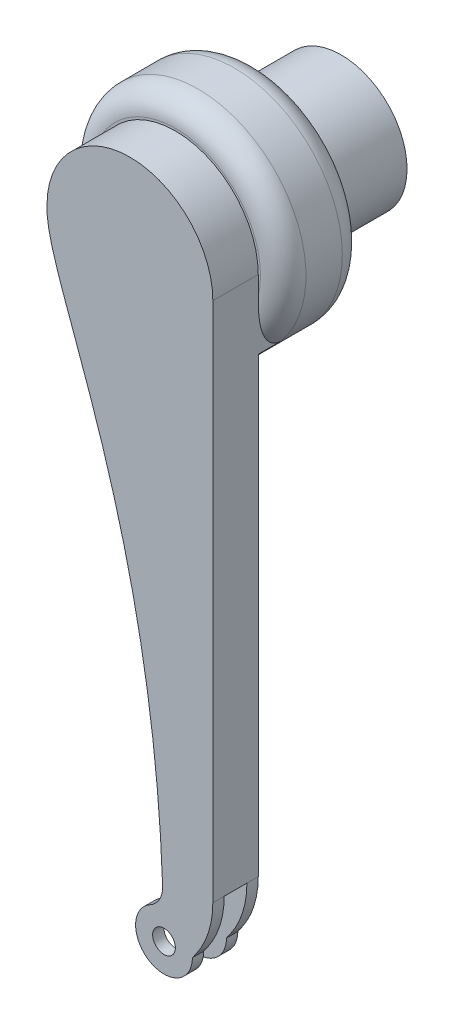
ISO-10303-21;
HEADER;
FILE_DESCRIPTION(('STEP AP214'),'2;1');
FILE_NAME('part.step','',(''),(''),'','','');
FILE_SCHEMA(('AUTOMOTIVE_DESIGN { 1 0 10303 214 1 1 1 1 }'));
ENDSEC;
DATA;
#1=APPLICATION_CONTEXT('core data for automotive mechanical design processes');
#2=APPLICATION_PROTOCOL_DEFINITION('international standard','automotive_design',2000,#1);
#3=PRODUCT_CONTEXT('',#1,'mechanical');
#4=PRODUCT('Part','Part','',(#3));
#5=PRODUCT_RELATED_PRODUCT_CATEGORY('part','',(#4));
#6=PRODUCT_DEFINITION_FORMATION('','',#4);
#7=PRODUCT_DEFINITION_CONTEXT('part definition',#1,'design');
#8=PRODUCT_DEFINITION('design','',#6,#7);
#9=PRODUCT_DEFINITION_SHAPE('','',#8);
#10=(LENGTH_UNIT() NAMED_UNIT(*) SI_UNIT(.MILLI.,.METRE.));
#11=(NAMED_UNIT(*) PLANE_ANGLE_UNIT() SI_UNIT($,.RADIAN.));
#12=(NAMED_UNIT(*) SI_UNIT($,.STERADIAN.) SOLID_ANGLE_UNIT());
#13=UNCERTAINTY_MEASURE_WITH_UNIT(LENGTH_MEASURE(1.E-05),#10,'distance_accuracy_value','');
#14=(GEOMETRIC_REPRESENTATION_CONTEXT(3) GLOBAL_UNCERTAINTY_ASSIGNED_CONTEXT((#13)) GLOBAL_UNIT_ASSIGNED_CONTEXT((#10,
#11,#12)) REPRESENTATION_CONTEXT('',''));
#15=CARTESIAN_POINT('',(0.,0.,0.));
#16=DIRECTION('',(0.,0.,1.));
#17=DIRECTION('',(1.,0.,0.));
#18=AXIS2_PLACEMENT_3D('',#15,#16,#17);
#19=CARTESIAN_POINT('',(14.3935138395394,-234.123931836955,166.));
#20=CARTESIAN_POINT('',(9.34180295752292,-94.6674336041747,166.));
#21=CARTESIAN_POINT('',(-37.9577807284117,-27.6638546174901,166.));
#22=CARTESIAN_POINT('',(-36.4999928582539,-0.0228330333449487,166.));
#23=B_SPLINE_CURVE_WITH_KNOTS('',3,(#19,#20,#21,#22),.UNSPECIFIED.,.F.,.F.,(4,4),(0.,
0.87838720733707),.UNSPECIFIED.);
#24=DIRECTION('',(0.,0.,-1.));
#25=VECTOR('',#24,1.);
#26=SURFACE_OF_LINEAR_EXTRUSION('',#23,#25);
#27=CARTESIAN_POINT('',(14.3935138395394,-234.123931836955,161.));
#28=CARTESIAN_POINT('',(9.34180295752292,-94.6674336041747,161.));
#29=CARTESIAN_POINT('',(-37.9577807284117,-27.6638546174901,161.));
#30=CARTESIAN_POINT('',(-36.4999928582539,-0.0228330333449487,161.));
#31=B_SPLINE_CURVE_WITH_KNOTS('',3,(#27,#28,#29,#30),.UNSPECIFIED.,.F.,.F.,(4,4),(0.,
0.87838720733707),.UNSPECIFIED.);
#32=CARTESIAN_POINT('',(14.3935138395395,-234.123931836956,161.));
#33=VERTEX_POINT('',#32);
#34=CARTESIAN_POINT('',(14.2119216844779,-229.555725830061,161.));
#35=VERTEX_POINT('',#34);
#36=EDGE_CURVE('E343',#33,#35,#31,.T.);
#37=ORIENTED_EDGE('',*,*,#36,.F.);
#38=DIRECTION('',(0.,0.,-1.));
#39=VECTOR('',#38,1.);
#40=CARTESIAN_POINT('',(14.3935138395395,-234.123931836956,166.));
#41=LINE('',#40,#39);
#42=CARTESIAN_POINT('',(14.3935138395395,-234.123931836956,166.));
#43=VERTEX_POINT('',#42);
#44=EDGE_CURVE('E292',#43,#33,#41,.T.);
#45=ORIENTED_EDGE('',*,*,#44,.F.);
#46=CARTESIAN_POINT('',(-36.4999928582539,-0.0228330333449564,166.));
#47=VERTEX_POINT('',#46);
#48=EDGE_CURVE('E240',#43,#47,#23,.T.);
#49=ORIENTED_EDGE('',*,*,#48,.T.);
#50=DIRECTION('',(0.,0.,-1.));
#51=VECTOR('',#50,1.);
#52=CARTESIAN_POINT('',(-36.4999928582539,-0.0228330333449564,166.));
#53=LINE('',#52,#51);
#54=CARTESIAN_POINT('',(-36.4999928582539,-0.0228330333449564,146.));
#55=VERTEX_POINT('',#54);
#56=EDGE_CURVE('E196',#47,#55,#53,.T.);
#57=ORIENTED_EDGE('',*,*,#56,.T.);
#58=CARTESIAN_POINT('',(14.3935138395394,-234.123931836955,146.));
#59=CARTESIAN_POINT('',(9.34180295752292,-94.6674336041747,146.));
#60=CARTESIAN_POINT('',(-37.9577807284117,-27.6638546174901,146.));
#61=CARTESIAN_POINT('',(-36.4999928582539,-0.0228330333449487,146.));
#62=B_SPLINE_CURVE_WITH_KNOTS('',3,(#58,#59,#60,#61),.UNSPECIFIED.,.F.,.F.,(4,4),(0.,
0.87838720733707),.UNSPECIFIED.);
#63=CARTESIAN_POINT('',(-34.018663089086,-15.7791178977551,146.));
#64=VERTEX_POINT('',#63);
#65=EDGE_CURVE('E200',#64,#55,#62,.T.);
#66=ORIENTED_EDGE('',*,*,#65,.F.);
#67=CARTESIAN_POINT('',(-25.8648449608881,-39.8404291536779,136.));
#68=CARTESIAN_POINT('',(-25.8648441366713,-39.8404314005146,136.100042739635));
#69=CARTESIAN_POINT('',(-25.8656964769187,-39.8380858399478,136.200068403138));
#70=CARTESIAN_POINT('',(-25.8690969384051,-39.8287279453894,136.39986629798));
#71=CARTESIAN_POINT('',(-25.8716449553815,-39.8217158983277,136.499638544522));
#72=CARTESIAN_POINT('',(-25.8818085753463,-39.7937456471833,136.798021538319));
#73=CARTESIAN_POINT('',(-25.8919438016662,-39.7658531845782,136.995943996672));
#74=CARTESIAN_POINT('',(-25.9185600922197,-39.6926000000448,137.386002694576));
#75=CARTESIAN_POINT('',(-25.9349774392155,-39.6474146725998,137.578176790767));
#76=CARTESIAN_POINT('',(-25.9738007321069,-39.5405526136909,137.957284744949));
#77=CARTESIAN_POINT('',(-25.9962077007511,-39.478873065781,138.144217701969));
#78=CARTESIAN_POINT('',(-26.0464600050365,-39.3405280757323,138.510860103824));
#79=CARTESIAN_POINT('',(-26.0742848483844,-39.2639191010004,138.690593782776));
#80=CARTESIAN_POINT('',(-26.1349234715684,-39.0969409649844,139.042637081974));
#81=CARTESIAN_POINT('',(-26.1677370790286,-39.0065722791367,139.214946958469));
#82=CARTESIAN_POINT('',(-26.2379162315993,-38.8132635920711,139.551895534234));
#83=CARTESIAN_POINT('',(-26.2752917883536,-38.7102959399215,139.716516223914));
#84=CARTESIAN_POINT('',(-26.3540413081918,-38.4932966015652,140.037368113552));
#85=CARTESIAN_POINT('',(-26.3954172363988,-38.3792594775337,140.193595131019));
#86=CARTESIAN_POINT('',(-26.5009555465884,-38.0883045877545,140.565347145879));
#87=CARTESIAN_POINT('',(-26.5670381170081,-37.9060595200095,140.776173678047));
#88=CARTESIAN_POINT('',(-26.7052284082117,-37.5247611812529,141.17992569032));
#89=CARTESIAN_POINT('',(-26.7773391712279,-37.3256994228638,141.372842026817));
#90=CARTESIAN_POINT('',(-26.9264840774253,-36.9137282754019,141.74143895786));
#91=CARTESIAN_POINT('',(-27.0035217154316,-36.7008090547561,141.917107088543));
#92=CARTESIAN_POINT('',(-27.1614964553944,-36.2638628732629,142.251889533188));
#93=CARTESIAN_POINT('',(-27.2424326258454,-36.0398385654677,142.411007773113));
#94=CARTESIAN_POINT('',(-27.4144656749786,-35.5632367962216,142.726681395038));
#95=CARTESIAN_POINT('',(-27.5058406504797,-35.3098530105248,142.881862749811));
#96=CARTESIAN_POINT('',(-27.691495190165,-34.7944307977251,143.175469173208));
#97=CARTESIAN_POINT('',(-27.7857764058113,-34.5323874435207,143.313884485876));
#98=CARTESIAN_POINT('',(-27.9765483491195,-34.0014338894614,143.5752717996));
#99=CARTESIAN_POINT('',(-28.0730396606381,-33.7325218728515,143.698239662839));
#100=CARTESIAN_POINT('',(-28.2684767146181,-33.1869926386877,143.930988922777));
#101=CARTESIAN_POINT('',(-28.3674362671631,-32.9103296669413,144.040650852921));
#102=CARTESIAN_POINT('',(-28.5665220388424,-32.3527171215986,144.246822285142));
#103=CARTESIAN_POINT('',(-28.6666477915293,-32.0717692488095,144.34333686211));
#104=CARTESIAN_POINT('',(-28.8676844257774,-31.5064861919726,144.524422304204));
#105=CARTESIAN_POINT('',(-28.9685949946948,-31.2221523349882,144.60899769175));
#106=CARTESIAN_POINT('',(-29.2470065506942,-30.4358135410953,144.826928585686));
#107=CARTESIAN_POINT('',(-29.4250433111612,-29.9308976158588,144.949144351218));
#108=CARTESIAN_POINT('',(-29.781404663724,-28.9150753472292,145.165945090686));
#109=CARTESIAN_POINT('',(-29.9597293627338,-28.4041657083063,145.260514044194));
#110=CARTESIAN_POINT('',(-30.3158719632625,-27.3774664665809,145.426781864326));
#111=CARTESIAN_POINT('',(-30.4936883800426,-26.8616697491574,145.498439364919));
#112=CARTESIAN_POINT('',(-30.8479830503886,-25.8262792954078,145.622897706842));
#113=CARTESIAN_POINT('',(-31.0244580781324,-25.3066801692982,145.675662069324));
#114=CARTESIAN_POINT('',(-31.3752210154419,-24.2646759158633,145.765837884587));
#115=CARTESIAN_POINT('',(-31.5495057189547,-23.7422679837245,145.803228912066));
#116=CARTESIAN_POINT('',(-31.8856212629157,-22.7240056824462,145.864061284088));
#117=CARTESIAN_POINT('',(-32.0476159895172,-22.2282426757222,145.888147513353));
#118=CARTESIAN_POINT('',(-32.3680752124843,-21.2357984006193,145.927698442091));
#119=CARTESIAN_POINT('',(-32.5265431110085,-20.7391185665374,145.943171829763));
#120=CARTESIAN_POINT('',(-32.8390973663724,-19.7456541930669,145.967564948986));
#121=CARTESIAN_POINT('',(-32.9931940789619,-19.2488733099555,145.976501679125));
#122=CARTESIAN_POINT('',(-33.2961115835715,-18.2559989814237,145.989622987812));
#123=CARTESIAN_POINT('',(-33.4449523569944,-17.7599118971913,145.993828006242));
#124=CARTESIAN_POINT('',(-33.6637700797346,-17.0161196763371,145.997714446595));
#125=CARTESIAN_POINT('',(-33.7357529823084,-16.7690088168644,145.998607348639));
#126=CARTESIAN_POINT('',(-33.8782989576823,-16.2743765171776,145.999749094493));
#127=CARTESIAN_POINT('',(-33.948862030697,-16.0268550770255,145.999997938399));
#128=CARTESIAN_POINT('',(-34.018663089086,-15.7791178977551,146.));
#129=B_SPLINE_CURVE_WITH_KNOTS('',3,(#67,#68,#69,#70,#71,#72,#73,#74,#75,#76,#77,#78,#79,#80,
#81,#82,#83,#84,#85,#86,#87,#88,#89,#90,#91,#92,#93,#94,#95,#96,#97,#98,#99,#100,#101,#102,#103,
#104,#105,#106,#107,#108,#109,#110,#111,#112,#113,#114,#115,#116,#117,#118,#119,#120,#121,#122,
#123,#124,#125,#126,#127,#128),.UNSPECIFIED.,.F.,.F.,(4,2,2,2,2,2,2,2,2,2,2,2,2,2,2,2,2,2,2,2,2,
2,2,2,2,2,2,2,2,2,4),(0.,0.300063459456936,0.600108470512177,1.19946539986309,1.79289784304718,
2.38643168167635,2.97776271130102,3.56907331342488,4.16170575979053,4.7546308216861,
5.6125129359846,6.47083063976316,7.32976408372103,8.18849330461224,9.12040436898164,
10.0528551222924,10.9855551155096,11.9260912333077,12.8662632681839,13.8060782162116,
15.452570127999,17.1000142457655,18.7504162015392,20.4039877834094,22.0597492869661,
23.6259937176312,25.1906553236676,26.7512334159787,28.3050439830849,29.0771892955142,
29.849334491339),.UNSPECIFIED.);
#130=CARTESIAN_POINT('',(-25.8648449608881,-39.8404291536779,136.));
#131=VERTEX_POINT('',#130);
#132=EDGE_CURVE('E213',#131,#64,#129,.T.);
#133=ORIENTED_EDGE('',*,*,#132,.F.);
#134=DIRECTION('',(0.,0.,-1.));
#135=VECTOR('',#134,1.);
#136=CARTESIAN_POINT('',(-25.8648449608881,-39.8404291536779,136.));
#137=LINE('',#136,#135);
#138=CARTESIAN_POINT('',(-25.864844960888,-39.8404291536779,146.));
#139=VERTEX_POINT('',#138);
#140=EDGE_CURVE('E207',#131,#139,#137,.F.);
#141=ORIENTED_EDGE('',*,*,#140,.T.);
#142=CARTESIAN_POINT('',(14.3935138395395,-234.123931836956,146.));
#143=VERTEX_POINT('',#142);
#144=EDGE_CURVE('E269',#143,#139,#62,.T.);
#145=ORIENTED_EDGE('',*,*,#144,.F.);
#146=CARTESIAN_POINT('',(14.3935138395395,-234.123931836956,151.));
#147=VERTEX_POINT('',#146);
#148=EDGE_CURVE('E268',#147,#143,#41,.T.);
#149=ORIENTED_EDGE('',*,*,#148,.F.);
#150=CARTESIAN_POINT('',(14.3935138395394,-234.123931836955,151.));
#151=CARTESIAN_POINT('',(9.34180295752292,-94.6674336041747,151.));
#152=CARTESIAN_POINT('',(-37.9577807284117,-27.6638546174901,151.));
#153=CARTESIAN_POINT('',(-36.4999928582539,-0.0228330333449487,151.));
#154=B_SPLINE_CURVE_WITH_KNOTS('',3,(#150,#151,#152,#153),.UNSPECIFIED.,.F.,.F.,(4,4),(0.,
0.87838720733707),.UNSPECIFIED.);
#155=CARTESIAN_POINT('',(14.2119216844779,-229.555725830061,151.));
#156=VERTEX_POINT('',#155);
#157=EDGE_CURVE('E59',#156,#147,#154,.F.);
#158=ORIENTED_EDGE('',*,*,#157,.F.);
#159=DIRECTION('',(0.,0.,-1.));
#160=VECTOR('',#159,1.);
#161=CARTESIAN_POINT('',(14.2119216844779,-229.555725830061,166.));
#162=LINE('',#161,#160);
#163=EDGE_CURVE('E174',#35,#156,#162,.T.);
#164=ORIENTED_EDGE('',*,*,#163,.F.);
#165=EDGE_LOOP('',(#37,#45,#49,#57,#66,#133,#141,#145,#149,#158,#164));
#166=FACE_BOUND('',#165,.T.);
#167=ADVANCED_FACE('F42',(#166),#26,.T.);
#168=CARTESIAN_POINT('',(-3.50000000000003,-229.555725830061,166.));
#169=DIRECTION('',(0.,0.,-1.));
#170=DIRECTION('',(1.,0.,0.));
#171=AXIS2_PLACEMENT_3D('',#168,#169,#170);
#172=CYLINDRICAL_SURFACE('',#171,40.);
#173=CARTESIAN_POINT('',(-3.50000000000003,-229.555725830061,161.));
#174=DIRECTION('',(0.,0.,-1.));
#175=DIRECTION('',(-1.,0.,0.));
#176=AXIS2_PLACEMENT_3D('',#173,#174,#175);
#177=CIRCLE('',#176,40.);
#178=CARTESIAN_POINT('',(36.5,-229.555725830061,161.));
#179=VERTEX_POINT('',#178);
#180=CARTESIAN_POINT('',(29.1730691639795,-252.631049260206,161.));
#181=VERTEX_POINT('',#180);
#182=EDGE_CURVE('E341',#179,#181,#177,.T.);
#183=ORIENTED_EDGE('',*,*,#182,.F.);
#184=DIRECTION('',(0.,0.,-1.));
#185=VECTOR('',#184,1.);
#186=CARTESIAN_POINT('',(36.5,-229.555725830061,166.));
#187=LINE('',#186,#185);
#188=CARTESIAN_POINT('',(36.5,-229.555725830061,166.));
#189=VERTEX_POINT('',#188);
#190=EDGE_CURVE('E185',#189,#179,#187,.T.);
#191=ORIENTED_EDGE('',*,*,#190,.F.);
#192=CARTESIAN_POINT('',(-3.50000000000003,-229.555725830061,166.));
#193=DIRECTION('',(0.,0.,-1.));
#194=DIRECTION('',(1.,0.,0.));
#195=AXIS2_PLACEMENT_3D('',#192,#193,#194);
#196=CIRCLE('',#195,40.);
#197=CARTESIAN_POINT('',(29.1730691639795,-252.631049260206,166.));
#198=VERTEX_POINT('',#197);
#199=EDGE_CURVE('E257',#189,#198,#196,.T.);
#200=ORIENTED_EDGE('',*,*,#199,.T.);
#201=DIRECTION('',(0.,0.,-1.));
#202=VECTOR('',#201,1.);
#203=CARTESIAN_POINT('',(29.1730691639795,-252.631049260206,166.));
#204=LINE('',#203,#202);
#205=EDGE_CURVE('E183',#198,#181,#204,.T.);
#206=ORIENTED_EDGE('',*,*,#205,.T.);
#207=EDGE_LOOP('',(#183,#191,#200,#206));
#208=FACE_BOUND('',#207,.T.);
#209=ADVANCED_FACE('F235',(#208),#172,.T.);
#210=CARTESIAN_POINT('',(-3.50000000000003,-229.555725830061,151.));
#211=DIRECTION('',(0.,0.,1.));
#212=DIRECTION('',(1.,0.,0.));
#213=AXIS2_PLACEMENT_3D('',#210,#211,#212);
#214=CIRCLE('',#213,40.);
#215=CARTESIAN_POINT('',(29.1730691639795,-252.631049260206,151.));
#216=VERTEX_POINT('',#215);
#217=CARTESIAN_POINT('',(36.5,-229.555725830061,151.));
#218=VERTEX_POINT('',#217);
#219=EDGE_CURVE('E157',#216,#218,#214,.T.);
#220=ORIENTED_EDGE('',*,*,#219,.F.);
#221=CARTESIAN_POINT('',(29.1730691639795,-252.631049260206,146.));
#222=VERTEX_POINT('',#221);
#223=EDGE_CURVE('E301',#216,#222,#204,.T.);
#224=ORIENTED_EDGE('',*,*,#223,.T.);
#225=CARTESIAN_POINT('',(-3.50000000000003,-229.555725830061,146.));
#226=DIRECTION('',(0.,0.,-1.));
#227=DIRECTION('',(1.,0.,0.));
#228=AXIS2_PLACEMENT_3D('',#225,#226,#227);
#229=CIRCLE('',#228,40.);
#230=CARTESIAN_POINT('',(36.5,-229.555725830061,146.));
#231=VERTEX_POINT('',#230);
#232=EDGE_CURVE('E182',#231,#222,#229,.T.);
#233=ORIENTED_EDGE('',*,*,#232,.F.);
#234=EDGE_CURVE('E179',#218,#231,#187,.T.);
#235=ORIENTED_EDGE('',*,*,#234,.F.);
#236=EDGE_LOOP('',(#220,#224,#233,#235));
#237=FACE_BOUND('',#236,.T.);
#238=ADVANCED_FACE('F180',(#237),#172,.T.);
#239=CARTESIAN_POINT('',(29.1730691639795,-252.631049260206,166.));
#240=DIRECTION('',(-0.816826729099489,0.57688308575363,0.));
#241=DIRECTION('',(-0.57688308575363,-0.816826729099489,0.));
#242=AXIS2_PLACEMENT_3D('',#239,#240,#241);
#243=PLANE('',#242);
#244=DIRECTION('',(-0.57688308575363,-0.816826729099489,0.));
#245=VECTOR('',#244,1.);
#246=CARTESIAN_POINT('',(29.1730691639795,-252.631049260206,161.));
#247=LINE('',#246,#245);
#248=CARTESIAN_POINT('',(27.5,-255.,161.));
#249=VERTEX_POINT('',#248);
#250=EDGE_CURVE('E344',#181,#249,#247,.T.);
#251=ORIENTED_EDGE('',*,*,#250,.F.);
#252=ORIENTED_EDGE('',*,*,#205,.F.);
#253=DIRECTION('',(-0.57688308575363,-0.816826729099489,0.));
#254=VECTOR('',#253,1.);
#255=CARTESIAN_POINT('',(29.1730691639795,-252.631049260206,166.));
#256=LINE('',#255,#254);
#257=CARTESIAN_POINT('',(27.5,-255.,166.));
#258=VERTEX_POINT('',#257);
#259=EDGE_CURVE('E260',#198,#258,#256,.T.);
#260=ORIENTED_EDGE('',*,*,#259,.T.);
#261=DIRECTION('',(0.,0.,-1.));
#262=VECTOR('',#261,1.);
#263=CARTESIAN_POINT('',(27.5,-255.,166.));
#264=LINE('',#263,#262);
#265=EDGE_CURVE('E299',#258,#249,#264,.T.);
#266=ORIENTED_EDGE('',*,*,#265,.T.);
#267=EDGE_LOOP('',(#251,#252,#260,#266));
#268=FACE_BOUND('',#267,.T.);
#269=ADVANCED_FACE('F412',(#268),#243,.F.);
#270=DIRECTION('',(0.57688308575363,0.816826729099489,0.));
#271=VECTOR('',#270,1.);
#272=CARTESIAN_POINT('',(29.1730691639795,-252.631049260206,151.));
#273=LINE('',#272,#271);
#274=CARTESIAN_POINT('',(27.5,-255.,151.));
#275=VERTEX_POINT('',#274);
#276=EDGE_CURVE('E162',#275,#216,#273,.T.);
#277=ORIENTED_EDGE('',*,*,#276,.F.);
#278=CARTESIAN_POINT('',(27.5,-255.,146.));
#279=VERTEX_POINT('',#278);
#280=EDGE_CURVE('E298',#275,#279,#264,.T.);
#281=ORIENTED_EDGE('',*,*,#280,.T.);
#282=DIRECTION('',(-0.57688308575363,-0.816826729099489,0.));
#283=VECTOR('',#282,1.);
#284=CARTESIAN_POINT('',(29.1730691639795,-252.631049260206,146.));
#285=LINE('',#284,#283);
#286=EDGE_CURVE('E284',#222,#279,#285,.T.);
#287=ORIENTED_EDGE('',*,*,#286,.F.);
#288=ORIENTED_EDGE('',*,*,#223,.F.);
#289=EDGE_LOOP('',(#277,#281,#287,#288));
#290=FACE_BOUND('',#289,.T.);
#291=ADVANCED_FACE('F309',(#290),#243,.F.);
#292=CARTESIAN_POINT('',(15.,-255.,166.));
#293=DIRECTION('',(0.,0.,-1.));
#294=DIRECTION('',(1.,0.,0.));
#295=AXIS2_PLACEMENT_3D('',#292,#293,#294);
#296=CYLINDRICAL_SURFACE('',#295,12.5);
#297=CARTESIAN_POINT('',(15.,-255.,161.));
#298=DIRECTION('',(0.,0.,-1.));
#299=DIRECTION('',(-1.,0.,0.));
#300=AXIS2_PLACEMENT_3D('',#297,#298,#299);
#301=CIRCLE('',#300,12.5);
#302=CARTESIAN_POINT('',(8.86927739920417,-244.106688272518,161.));
#303=VERTEX_POINT('',#302);
#304=EDGE_CURVE('E347',#249,#303,#301,.T.);
#305=ORIENTED_EDGE('',*,*,#304,.F.);
#306=ORIENTED_EDGE('',*,*,#265,.F.);
#307=CARTESIAN_POINT('',(15.,-255.,166.));
#308=DIRECTION('',(0.,0.,-1.));
#309=DIRECTION('',(-1.,0.,0.));
#310=AXIS2_PLACEMENT_3D('',#307,#308,#309);
#311=CIRCLE('',#310,12.5);
#312=CARTESIAN_POINT('',(8.86927739920417,-244.106688272518,166.));
#313=VERTEX_POINT('',#312);
#314=EDGE_CURVE('E263',#258,#313,#311,.T.);
#315=ORIENTED_EDGE('',*,*,#314,.T.);
#316=DIRECTION('',(0.,0.,-1.));
#317=VECTOR('',#316,1.);
#318=CARTESIAN_POINT('',(8.86927739920417,-244.106688272518,166.));
#319=LINE('',#318,#317);
#320=EDGE_CURVE('E296',#313,#303,#319,.T.);
#321=ORIENTED_EDGE('',*,*,#320,.T.);
#322=EDGE_LOOP('',(#305,#306,#315,#321));
#323=FACE_BOUND('',#322,.T.);
#324=ADVANCED_FACE('F393',(#323),#296,.T.);
#325=CARTESIAN_POINT('',(15.,-255.,151.));
#326=DIRECTION('',(0.,0.,1.));
#327=DIRECTION('',(1.,0.,0.));
#328=AXIS2_PLACEMENT_3D('',#325,#326,#327);
#329=CIRCLE('',#328,12.5);
#330=CARTESIAN_POINT('',(8.86927739920417,-244.106688272518,151.));
#331=VERTEX_POINT('',#330);
#332=EDGE_CURVE('E371',#331,#275,#329,.T.);
#333=ORIENTED_EDGE('',*,*,#332,.F.);
#334=CARTESIAN_POINT('',(8.86927739920417,-244.106688272518,146.));
#335=VERTEX_POINT('',#334);
#336=EDGE_CURVE('E295',#331,#335,#319,.T.);
#337=ORIENTED_EDGE('',*,*,#336,.T.);
#338=CARTESIAN_POINT('',(15.,-255.,146.));
#339=DIRECTION('',(0.,0.,-1.));
#340=DIRECTION('',(-1.,0.,0.));
#341=AXIS2_PLACEMENT_3D('',#338,#339,#340);
#342=CIRCLE('',#341,12.5);
#343=EDGE_CURVE('E287',#279,#335,#342,.T.);
#344=ORIENTED_EDGE('',*,*,#343,.F.);
#345=ORIENTED_EDGE('',*,*,#280,.F.);
#346=EDGE_LOOP('',(#333,#337,#344,#345));
#347=FACE_BOUND('',#346,.T.);
#348=ADVANCED_FACE('F312',(#347),#296,.T.);
#349=CARTESIAN_POINT('',(3.54024076980626,-234.637844060962,166.));
#350=DIRECTION('',(0.,0.,-1.));
#351=DIRECTION('',(1.,0.,0.));
#352=AXIS2_PLACEMENT_3D('',#349,#350,#351);
#353=CYLINDRICAL_SURFACE('',#352,10.8654333599806);
#354=CARTESIAN_POINT('',(3.54024076980626,-234.637844060962,161.));
#355=DIRECTION('',(0.,0.,-1.));
#356=DIRECTION('',(-1.,0.,0.));
#357=AXIS2_PLACEMENT_3D('',#354,#355,#356);
#358=CIRCLE('',#357,10.8654333599806);
#359=EDGE_CURVE('E380',#303,#33,#358,.F.);
#360=ORIENTED_EDGE('',*,*,#359,.F.);
#361=ORIENTED_EDGE('',*,*,#320,.F.);
#362=CARTESIAN_POINT('',(3.54024076980626,-234.637844060962,166.));
#363=DIRECTION('',(0.,0.,1.));
#364=DIRECTION('',(-1.,0.,0.));
#365=AXIS2_PLACEMENT_3D('',#362,#363,#364);
#366=CIRCLE('',#365,10.8654333599806);
#367=EDGE_CURVE('E266',#313,#43,#366,.T.);
#368=ORIENTED_EDGE('',*,*,#367,.T.);
#369=ORIENTED_EDGE('',*,*,#44,.T.);
#370=EDGE_LOOP('',(#360,#361,#368,#369));
#371=FACE_BOUND('',#370,.T.);
#372=ADVANCED_FACE('F391',(#371),#353,.F.);
#373=CARTESIAN_POINT('',(3.54024076980626,-234.637844060962,151.));
#374=DIRECTION('',(0.,0.,1.));
#375=DIRECTION('',(1.,0.,0.));
#376=AXIS2_PLACEMENT_3D('',#373,#374,#375);
#377=CIRCLE('',#376,10.8654333599806);
#378=EDGE_CURVE('E368',#147,#331,#377,.F.);
#379=ORIENTED_EDGE('',*,*,#378,.F.);
#380=ORIENTED_EDGE('',*,*,#148,.T.);
#381=CARTESIAN_POINT('',(3.54024076980626,-234.637844060962,146.));
#382=DIRECTION('',(0.,0.,1.));
#383=DIRECTION('',(-1.,0.,0.));
#384=AXIS2_PLACEMENT_3D('',#381,#382,#383);
#385=CIRCLE('',#384,10.8654333599806);
#386=EDGE_CURVE('E248',#335,#143,#385,.T.);
#387=ORIENTED_EDGE('',*,*,#386,.F.);
#388=ORIENTED_EDGE('',*,*,#336,.F.);
#389=EDGE_LOOP('',(#379,#380,#387,#388));
#390=FACE_BOUND('',#389,.T.);
#391=ADVANCED_FACE('F396',(#390),#353,.F.);
#392=CARTESIAN_POINT('',(15.,-255.,129.));
#393=DIRECTION('',(0.,0.,1.));
#394=DIRECTION('',(-1.,0.,0.));
#395=AXIS2_PLACEMENT_3D('',#392,#393,#394);
#396=CYLINDRICAL_SURFACE('',#395,5.);
#397=CARTESIAN_POINT('',(15.,-255.,166.));
#398=DIRECTION('',(0.,0.,-1.));
#399=DIRECTION('',(-1.,0.,0.));
#400=AXIS2_PLACEMENT_3D('',#397,#398,#399);
#401=CIRCLE('',#400,5.);
#402=CARTESIAN_POINT('',(9.99999999999997,-255.,166.));
#403=VERTEX_POINT('',#402);
#404=EDGE_CURVE('E357',#403,#403,#401,.T.);
#405=ORIENTED_EDGE('',*,*,#404,.F.);
#406=EDGE_LOOP('',(#405));
#407=FACE_BOUND('',#406,.T.);
#408=CARTESIAN_POINT('',(15.,-255.,161.));
#409=DIRECTION('',(0.,0.,-1.));
#410=DIRECTION('',(-1.,0.,0.));
#411=AXIS2_PLACEMENT_3D('',#408,#409,#410);
#412=CIRCLE('',#411,5.);
#413=CARTESIAN_POINT('',(9.99999999999997,-255.,161.));
#414=VERTEX_POINT('',#413);
#415=EDGE_CURVE('E46',#414,#414,#412,.F.);
#416=ORIENTED_EDGE('',*,*,#415,.F.);
#417=EDGE_LOOP('',(#416));
#418=FACE_BOUND('',#417,.T.);
#419=ADVANCED_FACE('F398',(#407,#418),#396,.F.);
#420=CARTESIAN_POINT('',(15.,-255.,146.));
#421=DIRECTION('',(0.,0.,-1.));
#422=DIRECTION('',(-1.,0.,0.));
#423=AXIS2_PLACEMENT_3D('',#420,#421,#422);
#424=CIRCLE('',#423,5.);
#425=CARTESIAN_POINT('',(9.99999999999997,-255.,146.));
#426=VERTEX_POINT('',#425);
#427=EDGE_CURVE('E359',#426,#426,#424,.T.);
#428=ORIENTED_EDGE('',*,*,#427,.T.);
#429=EDGE_LOOP('',(#428));
#430=FACE_BOUND('',#429,.T.);
#431=CARTESIAN_POINT('',(15.,-255.,151.));
#432=DIRECTION('',(0.,0.,1.));
#433=DIRECTION('',(1.,0.,0.));
#434=AXIS2_PLACEMENT_3D('',#431,#432,#433);
#435=CIRCLE('',#434,5.);
#436=CARTESIAN_POINT('',(20.,-255.,151.));
#437=VERTEX_POINT('',#436);
#438=EDGE_CURVE('E175',#437,#437,#435,.F.);
#439=ORIENTED_EDGE('',*,*,#438,.F.);
#440=EDGE_LOOP('',(#439));
#441=FACE_BOUND('',#440,.T.);
#442=ADVANCED_FACE('F404',(#430,#441),#396,.F.);
#443=CARTESIAN_POINT('',(0.,0.,110.));
#444=DIRECTION('',(0.,0.,1.));
#445=DIRECTION('',(-1.,0.,0.));
#446=AXIS2_PLACEMENT_3D('',#443,#444,#445);
#447=CYLINDRICAL_SURFACE('',#446,47.5);
#448=CARTESIAN_POINT('',(0.,0.,120.));
#449=DIRECTION('',(0.,0.,1.));
#450=DIRECTION('',(1.,0.,0.));
#451=AXIS2_PLACEMENT_3D('',#448,#449,#450);
#452=CIRCLE('',#451,47.5);
#453=CARTESIAN_POINT('',(47.5,0.,120.));
#454=VERTEX_POINT('',#453);
#455=EDGE_CURVE('E11',#454,#454,#452,.F.);
#456=ORIENTED_EDGE('',*,*,#455,.F.);
#457=EDGE_LOOP('',(#456));
#458=FACE_BOUND('',#457,.T.);
#459=CARTESIAN_POINT('',(0.,0.,136.));
#460=DIRECTION('',(0.,0.,1.));
#461=DIRECTION('',(1.,0.,0.));
#462=AXIS2_PLACEMENT_3D('',#459,#460,#461);
#463=CIRCLE('',#462,47.5);
#464=CARTESIAN_POINT('',(36.5,-30.3973683071413,136.));
#465=VERTEX_POINT('',#464);
#466=EDGE_CURVE('E203',#465,#131,#463,.T.);
#467=ORIENTED_EDGE('',*,*,#466,.F.);
#468=DIRECTION('',(0.,0.,1.));
#469=VECTOR('',#468,1.);
#470=CARTESIAN_POINT('',(36.5,-30.3973683071413,146.));
#471=LINE('',#470,#469);
#472=CARTESIAN_POINT('',(36.5,-30.3973683071413,146.));
#473=VERTEX_POINT('',#472);
#474=EDGE_CURVE('E201',#473,#465,#471,.F.);
#475=ORIENTED_EDGE('',*,*,#474,.F.);
#476=CARTESIAN_POINT('',(0.,0.,146.));
#477=DIRECTION('',(0.,0.,1.));
#478=DIRECTION('',(1.,0.,0.));
#479=AXIS2_PLACEMENT_3D('',#476,#477,#478);
#480=CIRCLE('',#479,47.5);
#481=EDGE_CURVE('E198',#139,#473,#480,.T.);
#482=ORIENTED_EDGE('',*,*,#481,.F.);
#483=ORIENTED_EDGE('',*,*,#140,.F.);
#484=EDGE_LOOP('',(#467,#475,#482,#483));
#485=FACE_BOUND('',#484,.T.);
#486=ADVANCED_FACE('F323',(#458,#485),#447,.T.);
#487=CARTESIAN_POINT('',(0.,0.,110.));
#488=DIRECTION('',(0.,0.,-1.));
#489=DIRECTION('',(1.,0.,0.));
#490=AXIS2_PLACEMENT_3D('',#487,#488,#489);
#491=PLANE('',#490);
#492=CARTESIAN_POINT('',(0.,0.,110.));
#493=DIRECTION('',(0.,0.,1.));
#494=DIRECTION('',(1.,0.,0.));
#495=AXIS2_PLACEMENT_3D('',#492,#493,#494);
#496=CIRCLE('',#495,37.5);
#497=CARTESIAN_POINT('',(37.5,0.,110.));
#498=VERTEX_POINT('',#497);
#499=EDGE_CURVE('E51',#498,#498,#496,.T.);
#500=ORIENTED_EDGE('',*,*,#499,.F.);
#501=EDGE_LOOP('',(#500));
#502=FACE_BOUND('',#501,.T.);
#503=CARTESIAN_POINT('',(0.,0.,110.));
#504=DIRECTION('',(0.,0.,1.));
#505=DIRECTION('',(1.,0.,0.));
#506=AXIS2_PLACEMENT_3D('',#503,#504,#505);
#507=CIRCLE('',#506,29.);
#508=CARTESIAN_POINT('',(29.,0.,110.));
#509=VERTEX_POINT('',#508);
#510=EDGE_CURVE('E204',#509,#509,#507,.T.);
#511=ORIENTED_EDGE('',*,*,#510,.T.);
#512=EDGE_LOOP('',(#511));
#513=FACE_BOUND('',#512,.T.);
#514=ADVANCED_FACE('F238',(#502,#513),#491,.T.);
#515=CARTESIAN_POINT('',(0.,0.,146.));
#516=DIRECTION('',(0.,0.,-1.));
#517=DIRECTION('',(1.,0.,0.));
#518=AXIS2_PLACEMENT_3D('',#515,#516,#517);
#519=PLANE('',#518);
#520=ORIENTED_EDGE('',*,*,#65,.T.);
#521=CARTESIAN_POINT('',(0.,0.,146.));
#522=DIRECTION('',(0.,0.,-1.));
#523=DIRECTION('',(-1.,0.,0.));
#524=AXIS2_PLACEMENT_3D('',#521,#522,#523);
#525=CIRCLE('',#524,36.5);
#526=CARTESIAN_POINT('',(36.5,0.,146.));
#527=VERTEX_POINT('',#526);
#528=EDGE_CURVE('E273',#55,#527,#525,.T.);
#529=ORIENTED_EDGE('',*,*,#528,.T.);
#530=DIRECTION('',(0.,-1.,0.));
#531=VECTOR('',#530,1.);
#532=CARTESIAN_POINT('',(36.5,0.,146.));
#533=LINE('',#532,#531);
#534=CARTESIAN_POINT('',(36.5,-8.60232526704266,146.));
#535=VERTEX_POINT('',#534);
#536=EDGE_CURVE('E280',#527,#535,#533,.T.);
#537=ORIENTED_EDGE('',*,*,#536,.T.);
#538=CARTESIAN_POINT('',(0.,0.,146.));
#539=DIRECTION('',(0.,0.,1.));
#540=DIRECTION('',(1.,0.,0.));
#541=AXIS2_PLACEMENT_3D('',#538,#539,#540);
#542=CIRCLE('',#541,37.5);
#543=EDGE_CURVE('E210',#64,#535,#542,.F.);
#544=ORIENTED_EDGE('',*,*,#543,.F.);
#545=EDGE_LOOP('',(#520,#529,#537,#544));
#546=FACE_BOUND('',#545,.T.);
#547=ADVANCED_FACE('F330',(#546),#519,.F.);
#548=CARTESIAN_POINT('',(0.,0.,166.));
#549=DIRECTION('',(0.,0.,-1.));
#550=DIRECTION('',(1.,0.,0.));
#551=AXIS2_PLACEMENT_3D('',#548,#549,#550);
#552=CYLINDRICAL_SURFACE('',#551,36.5);
#553=ORIENTED_EDGE('',*,*,#528,.F.);
#554=ORIENTED_EDGE('',*,*,#56,.F.);
#555=CARTESIAN_POINT('',(0.,0.,166.));
#556=DIRECTION('',(0.,0.,-1.));
#557=DIRECTION('',(-1.,0.,0.));
#558=AXIS2_PLACEMENT_3D('',#555,#556,#557);
#559=CIRCLE('',#558,36.5);
#560=CARTESIAN_POINT('',(36.5,0.,166.));
#561=VERTEX_POINT('',#560);
#562=EDGE_CURVE('E247',#47,#561,#559,.T.);
#563=ORIENTED_EDGE('',*,*,#562,.T.);
#564=DIRECTION('',(0.,0.,-1.));
#565=VECTOR('',#564,1.);
#566=CARTESIAN_POINT('',(36.5,0.,166.));
#567=LINE('',#566,#565);
#568=EDGE_CURVE('E191',#561,#527,#567,.T.);
#569=ORIENTED_EDGE('',*,*,#568,.T.);
#570=EDGE_LOOP('',(#553,#554,#563,#569));
#571=FACE_BOUND('',#570,.T.);
#572=ADVANCED_FACE('F237',(#571),#552,.T.);
#573=CARTESIAN_POINT('',(36.5,0.,166.));
#574=DIRECTION('',(-1.,0.,0.));
#575=DIRECTION('',(0.,-1.,0.));
#576=AXIS2_PLACEMENT_3D('',#573,#574,#575);
#577=PLANE('',#576);
#578=ORIENTED_EDGE('',*,*,#536,.F.);
#579=ORIENTED_EDGE('',*,*,#568,.F.);
#580=DIRECTION('',(0.,-1.,0.));
#581=VECTOR('',#580,1.);
#582=CARTESIAN_POINT('',(36.5,0.,166.));
#583=LINE('',#582,#581);
#584=EDGE_CURVE('E255',#561,#189,#583,.T.);
#585=ORIENTED_EDGE('',*,*,#584,.T.);
#586=ORIENTED_EDGE('',*,*,#190,.T.);
#587=EDGE_CURVE('E171',#179,#218,#187,.T.);
#588=ORIENTED_EDGE('',*,*,#587,.T.);
#589=ORIENTED_EDGE('',*,*,#234,.T.);
#590=EDGE_CURVE('E67',#473,#231,#533,.T.);
#591=ORIENTED_EDGE('',*,*,#590,.F.);
#592=ORIENTED_EDGE('',*,*,#474,.T.);
#593=CARTESIAN_POINT('',(36.5,-8.60232526704266,146.));
#594=CARTESIAN_POINT('',(36.5,-9.05414424581882,145.999970074315));
#595=CARTESIAN_POINT('',(36.5,-9.50598112951785,145.998387785336));
#596=CARTESIAN_POINT('',(36.5,-10.4096883777123,145.990456226196));
#597=CARTESIAN_POINT('',(36.5,-10.8615587344576,145.984106130646));
#598=CARTESIAN_POINT('',(36.5,-11.7668101612446,145.964940925135));
#599=CARTESIAN_POINT('',(36.5,-12.2201907764554,145.952102487297));
#600=CARTESIAN_POINT('',(36.5,-13.1266252451774,145.918059340683));
#601=CARTESIAN_POINT('',(36.5,-13.5796791146572,145.896855073061));
#602=CARTESIAN_POINT('',(36.5,-14.4912396983546,145.84368265488));
#603=CARTESIAN_POINT('',(36.5,-14.9497384839008,145.811574616642));
#604=CARTESIAN_POINT('',(36.5,-15.8656337702798,145.734352981297));
#605=CARTESIAN_POINT('',(36.5,-16.3230303395661,145.689240214001));
#606=CARTESIAN_POINT('',(36.5,-17.2354255242785,145.583561630213));
#607=CARTESIAN_POINT('',(36.5,-17.6904265743353,145.523017177168));
#608=CARTESIAN_POINT('',(36.5,-18.5975967792603,145.383721929429));
#609=CARTESIAN_POINT('',(36.5,-19.0497664287783,145.304974411452));
#610=CARTESIAN_POINT('',(36.5,-19.8942463776723,145.137336487239));
#611=CARTESIAN_POINT('',(36.5,-20.2870416454153,145.050906109972));
#612=CARTESIAN_POINT('',(36.5,-21.0682093878946,144.859566712684));
#613=CARTESIAN_POINT('',(36.5,-21.4565812180384,144.754655035301));
#614=CARTESIAN_POINT('',(36.5,-22.2271858872887,144.52399361904));
#615=CARTESIAN_POINT('',(36.5,-22.6094180757592,144.398241687433));
#616=CARTESIAN_POINT('',(36.5,-23.3654381430066,144.123389663628));
#617=CARTESIAN_POINT('',(36.5,-23.7392265460714,143.974291025648));
#618=CARTESIAN_POINT('',(36.5,-24.4814108710508,143.647440521166));
#619=CARTESIAN_POINT('',(36.5,-24.8496213526497,143.469263622099));
#620=CARTESIAN_POINT('',(36.5,-25.5703552872131,143.083109109458));
#621=CARTESIAN_POINT('',(36.5,-25.922873989559,142.875122550482));
#622=CARTESIAN_POINT('',(36.5,-26.6054613842915,142.427462325623));
#623=CARTESIAN_POINT('',(36.5,-26.9356119045183,142.187914785409));
#624=CARTESIAN_POINT('',(36.5,-27.5677301388787,141.674570009708));
#625=CARTESIAN_POINT('',(36.5,-27.8697275957716,141.400809651558));
#626=CARTESIAN_POINT('',(36.5,-28.4576677339841,140.79654525007));
#627=CARTESIAN_POINT('',(36.5,-28.7409526244942,140.463393787645));
#628=CARTESIAN_POINT('',(36.5,-29.1247559338261,139.933972229019));
#629=CARTESIAN_POINT('',(36.5,-29.245886991452,139.752450408922));
#630=CARTESIAN_POINT('',(36.5,-29.4727435725829,139.379947786813));
#631=CARTESIAN_POINT('',(36.5,-29.578469214759,139.18896705768));
#632=CARTESIAN_POINT('',(36.5,-29.7737646311301,138.796310204882));
#633=CARTESIAN_POINT('',(36.5,-29.8631474963077,138.59454081353));
#634=CARTESIAN_POINT('',(36.5,-30.0225838166778,138.183511414366));
#635=CARTESIAN_POINT('',(36.5,-30.0926411563494,137.974252921449));
#636=CARTESIAN_POINT('',(36.5,-30.2117707732555,137.550410453087));
#637=CARTESIAN_POINT('',(36.5,-30.2608961533075,137.335841432724));
#638=CARTESIAN_POINT('',(36.5,-30.3372282209687,136.902958548776));
#639=CARTESIAN_POINT('',(36.5,-30.364454024913,136.684648121507));
#640=CARTESIAN_POINT('',(36.5,-30.3860667785072,136.38810311353));
#641=CARTESIAN_POINT('',(36.5,-30.3903056158983,136.310499054106));
#642=CARTESIAN_POINT('',(36.5,-30.3959546105138,136.155267447099));
#643=CARTESIAN_POINT('',(36.5,-30.3973676530851,136.077640004503));
#644=CARTESIAN_POINT('',(36.5,-30.3973683071414,136.));
#645=B_SPLINE_CURVE_WITH_KNOTS('',3,(#593,#594,#595,#596,#597,#598,#599,#600,#601,#602,#603,
#604,#605,#606,#607,#608,#609,#610,#611,#612,#613,#614,#615,#616,#617,#618,#619,#620,#621,#622,
#623,#624,#625,#626,#627,#628,#629,#630,#631,#632,#633,#634,#635,#636,#637,#638,#639,#640,#641,
#642,#643,#644),.UNSPECIFIED.,.F.,.F.,(4,2,2,2,2,2,2,2,2,2,2,2,2,2,2,2,2,2,2,2,2,2,2,2,2,4),(0.,
1.35548184494977,2.71119840072689,4.07182428460674,5.43237842815608,6.81109182282649,
8.18971726340861,9.56644442009518,10.9429239460736,12.1491151327365,13.3554798953136,
14.5619716675522,15.7683883197516,16.9943478941856,18.2206761327982,19.4422444288581,
20.6625071963916,21.9693160905301,22.6233796420732,23.2774381549612,23.9385638269666,
24.599556514065,25.2588621811713,25.9175917080285,26.1507119894132,26.3835941158375),.UNSPECIFIED.);
#646=EDGE_CURVE('E220',#535,#465,#645,.T.);
#647=ORIENTED_EDGE('',*,*,#646,.F.);
#648=EDGE_LOOP('',(#578,#579,#585,#586,#588,#589,#591,#592,#647));
#649=FACE_BOUND('',#648,.T.);
#650=ADVANCED_FACE('F188',(#649),#577,.F.);
#651=CARTESIAN_POINT('',(-13.4943015414226,-75.1425786919118,166.));
#652=DIRECTION('',(0.,0.,1.));
#653=DIRECTION('',(-1.,0.,0.));
#654=AXIS2_PLACEMENT_3D('',#651,#652,#653);
#655=PLANE('',#654);
#656=ORIENTED_EDGE('',*,*,#404,.T.);
#657=EDGE_LOOP('',(#656));
#658=FACE_BOUND('',#657,.T.);
#659=ORIENTED_EDGE('',*,*,#48,.F.);
#660=ORIENTED_EDGE('',*,*,#367,.F.);
#661=ORIENTED_EDGE('',*,*,#314,.F.);
#662=ORIENTED_EDGE('',*,*,#259,.F.);
#663=ORIENTED_EDGE('',*,*,#199,.F.);
#664=ORIENTED_EDGE('',*,*,#584,.F.);
#665=ORIENTED_EDGE('',*,*,#562,.F.);
#666=EDGE_LOOP('',(#659,#660,#661,#662,#663,#664,#665));
#667=FACE_BOUND('',#666,.T.);
#668=ADVANCED_FACE('F336',(#658,#667),#655,.T.);
#669=CARTESIAN_POINT('',(-13.4943015414226,-75.1425786919118,146.));
#670=DIRECTION('',(0.,0.,1.));
#671=DIRECTION('',(-1.,0.,0.));
#672=AXIS2_PLACEMENT_3D('',#669,#670,#671);
#673=PLANE('',#672);
#674=ORIENTED_EDGE('',*,*,#427,.F.);
#675=EDGE_LOOP('',(#674));
#676=FACE_BOUND('',#675,.T.);
#677=ORIENTED_EDGE('',*,*,#481,.T.);
#678=ORIENTED_EDGE('',*,*,#590,.T.);
#679=ORIENTED_EDGE('',*,*,#232,.T.);
#680=ORIENTED_EDGE('',*,*,#286,.T.);
#681=ORIENTED_EDGE('',*,*,#343,.T.);
#682=ORIENTED_EDGE('',*,*,#386,.T.);
#683=ORIENTED_EDGE('',*,*,#144,.T.);
#684=EDGE_LOOP('',(#677,#678,#679,#680,#681,#682,#683));
#685=FACE_BOUND('',#684,.T.);
#686=ADVANCED_FACE('F316',(#676,#685),#673,.F.);
#687=CARTESIAN_POINT('',(0.,0.,73.));
#688=DIRECTION('',(0.,0.,1.));
#689=DIRECTION('',(-1.,0.,0.));
#690=AXIS2_PLACEMENT_3D('',#687,#688,#689);
#691=CYLINDRICAL_SURFACE('',#690,29.);
#692=CARTESIAN_POINT('',(0.,0.,73.));
#693=DIRECTION('',(0.,0.,1.));
#694=DIRECTION('',(1.,0.,0.));
#695=AXIS2_PLACEMENT_3D('',#692,#693,#694);
#696=CIRCLE('',#695,29.);
#697=CARTESIAN_POINT('',(29.,0.,73.));
#698=VERTEX_POINT('',#697);
#699=EDGE_CURVE('E274',#698,#698,#696,.T.);
#700=ORIENTED_EDGE('',*,*,#699,.T.);
#701=EDGE_LOOP('',(#700));
#702=FACE_BOUND('',#701,.T.);
#703=ORIENTED_EDGE('',*,*,#510,.F.);
#704=EDGE_LOOP('',(#703));
#705=FACE_BOUND('',#704,.T.);
#706=ADVANCED_FACE('F446',(#702,#705),#691,.T.);
#707=CARTESIAN_POINT('',(0.,0.,73.));
#708=DIRECTION('',(0.,0.,-1.));
#709=DIRECTION('',(1.,0.,0.));
#710=AXIS2_PLACEMENT_3D('',#707,#708,#709);
#711=PLANE('',#710);
#712=ORIENTED_EDGE('',*,*,#699,.F.);
#713=EDGE_LOOP('',(#712));
#714=FACE_BOUND('',#713,.T.);
#715=ADVANCED_FACE('F448',(#714),#711,.T.);
#716=CARTESIAN_POINT('',(0.,0.,136.));
#717=DIRECTION('',(0.,0.,-1.));
#718=DIRECTION('',(1.,0.,0.));
#719=AXIS2_PLACEMENT_3D('',#716,#717,#718);
#720=TOROIDAL_SURFACE('',#719,37.5,10.);
#721=ORIENTED_EDGE('',*,*,#646,.T.);
#722=ORIENTED_EDGE('',*,*,#466,.T.);
#723=ORIENTED_EDGE('',*,*,#132,.T.);
#724=ORIENTED_EDGE('',*,*,#543,.T.);
#725=EDGE_LOOP('',(#721,#722,#723,#724));
#726=FACE_BOUND('',#725,.T.);
#727=ADVANCED_FACE('F227',(#726),#720,.T.);
#728=CARTESIAN_POINT('',(0.,0.,120.));
#729=DIRECTION('',(0.,0.,-1.));
#730=DIRECTION('',(1.,0.,0.));
#731=AXIS2_PLACEMENT_3D('',#728,#729,#730);
#732=TOROIDAL_SURFACE('',#731,37.5,10.);
#733=ORIENTED_EDGE('',*,*,#455,.T.);
#734=EDGE_LOOP('',(#733));
#735=FACE_BOUND('',#734,.T.);
#736=ORIENTED_EDGE('',*,*,#499,.T.);
#737=EDGE_LOOP('',(#736));
#738=FACE_BOUND('',#737,.T.);
#739=ADVANCED_FACE('F44',(#735,#738),#732,.T.);
#740=CARTESIAN_POINT('',(45.,-229.555725830061,161.));
#741=DIRECTION('',(0.,-1.,0.));
#742=DIRECTION('',(0.,0.,-1.));
#743=AXIS2_PLACEMENT_3D('',#740,#741,#742);
#744=PLANE('',#743);
#745=ORIENTED_EDGE('',*,*,#163,.T.);
#746=DIRECTION('',(-1.,0.,0.));
#747=VECTOR('',#746,1.);
#748=CARTESIAN_POINT('',(45.,-229.555725830061,151.));
#749=LINE('',#748,#747);
#750=EDGE_CURVE('E160',#218,#156,#749,.T.);
#751=ORIENTED_EDGE('',*,*,#750,.F.);
#752=ORIENTED_EDGE('',*,*,#587,.F.);
#753=DIRECTION('',(-1.,0.,0.));
#754=VECTOR('',#753,1.);
#755=CARTESIAN_POINT('',(45.,-229.555725830061,161.));
#756=LINE('',#755,#754);
#757=EDGE_CURVE('E176',#179,#35,#756,.T.);
#758=ORIENTED_EDGE('',*,*,#757,.T.);
#759=EDGE_LOOP('',(#745,#751,#752,#758));
#760=FACE_BOUND('',#759,.T.);
#761=ADVANCED_FACE('F168',(#760),#744,.T.);
#762=CARTESIAN_POINT('',(45.,-229.555725830061,161.));
#763=DIRECTION('',(0.,0.,-1.));
#764=DIRECTION('',(-1.,0.,0.));
#765=AXIS2_PLACEMENT_3D('',#762,#763,#764);
#766=PLANE('',#765);
#767=ORIENTED_EDGE('',*,*,#415,.T.);
#768=EDGE_LOOP('',(#767));
#769=FACE_BOUND('',#768,.T.);
#770=ORIENTED_EDGE('',*,*,#36,.T.);
#771=ORIENTED_EDGE('',*,*,#757,.F.);
#772=ORIENTED_EDGE('',*,*,#182,.T.);
#773=ORIENTED_EDGE('',*,*,#250,.T.);
#774=ORIENTED_EDGE('',*,*,#304,.T.);
#775=ORIENTED_EDGE('',*,*,#359,.T.);
#776=EDGE_LOOP('',(#770,#771,#772,#773,#774,#775));
#777=FACE_BOUND('',#776,.T.);
#778=ADVANCED_FACE('F386',(#769,#777),#766,.T.);
#779=CARTESIAN_POINT('',(45.,-229.555725830061,151.));
#780=DIRECTION('',(0.,0.,1.));
#781=DIRECTION('',(1.,0.,0.));
#782=AXIS2_PLACEMENT_3D('',#779,#780,#781);
#783=PLANE('',#782);
#784=ORIENTED_EDGE('',*,*,#438,.T.);
#785=EDGE_LOOP('',(#784));
#786=FACE_BOUND('',#785,.T.);
#787=ORIENTED_EDGE('',*,*,#157,.T.);
#788=ORIENTED_EDGE('',*,*,#378,.T.);
#789=ORIENTED_EDGE('',*,*,#332,.T.);
#790=ORIENTED_EDGE('',*,*,#276,.T.);
#791=ORIENTED_EDGE('',*,*,#219,.T.);
#792=ORIENTED_EDGE('',*,*,#750,.T.);
#793=EDGE_LOOP('',(#787,#788,#789,#790,#791,#792));
#794=FACE_BOUND('',#793,.T.);
#795=ADVANCED_FACE('F159',(#786,#794),#783,.T.);
#796=CLOSED_SHELL('',(#167,#209,#238,#269,#291,#324,#348,#372,#391,#419,#442,#486,#514,#547,
#572,#650,#668,#686,#706,#715,#727,#739,#761,#778,#795));
#797=MANIFOLD_SOLID_BREP('B2',#796);
#798=ADVANCED_BREP_SHAPE_REPRESENTATION('',(#18,#797),#14);
#799=SHAPE_DEFINITION_REPRESENTATION(#9,#798);
ENDSEC;
END-ISO-10303-21;
